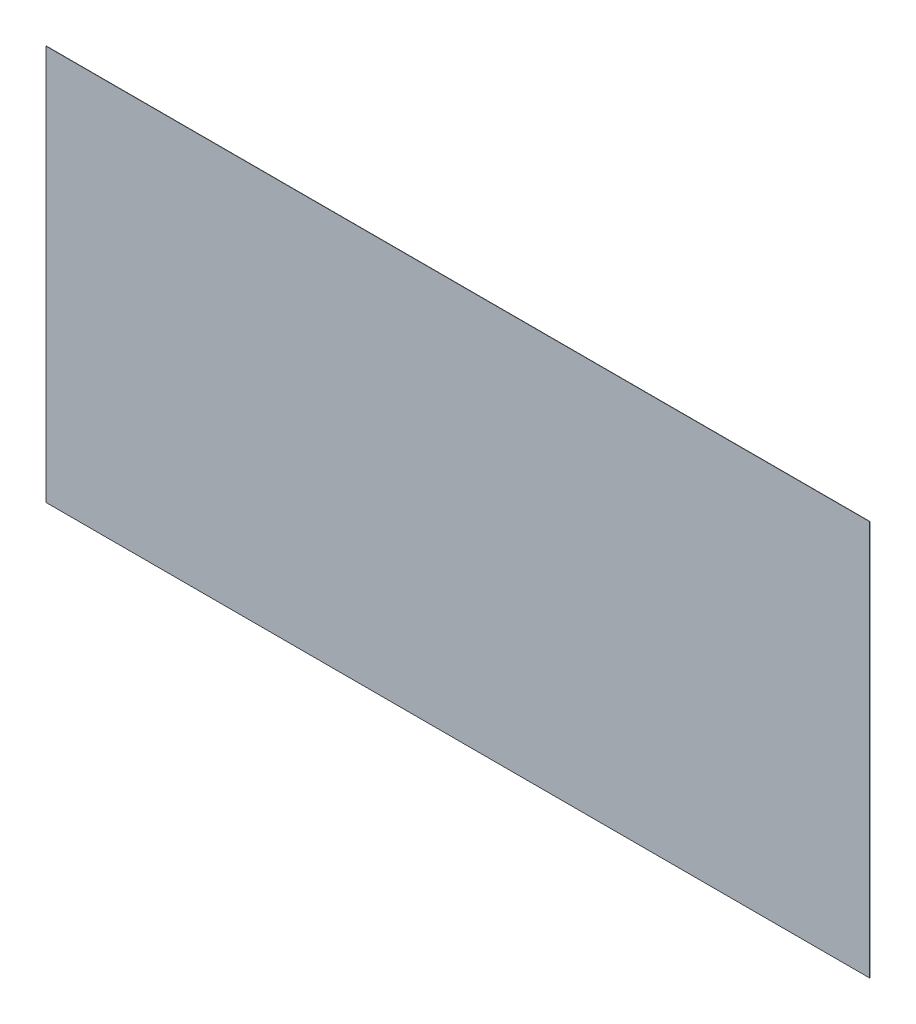
ISO-10303-21;
HEADER;
FILE_DESCRIPTION(('STEP AP214'),'2;1');
FILE_NAME('part.step','',(''),(''),'','','');
FILE_SCHEMA(('AUTOMOTIVE_DESIGN { 1 0 10303 214 1 1 1 1 }'));
ENDSEC;
DATA;
#1=APPLICATION_CONTEXT('core data for automotive mechanical design processes');
#2=APPLICATION_PROTOCOL_DEFINITION('international standard','automotive_design',2000,#1);
#3=PRODUCT_CONTEXT('',#1,'mechanical');
#4=PRODUCT('Part','Part','',(#3));
#5=PRODUCT_RELATED_PRODUCT_CATEGORY('part','',(#4));
#6=PRODUCT_DEFINITION_FORMATION('','',#4);
#7=PRODUCT_DEFINITION_CONTEXT('part definition',#1,'design');
#8=PRODUCT_DEFINITION('design','',#6,#7);
#9=PRODUCT_DEFINITION_SHAPE('','',#8);
#10=(LENGTH_UNIT() NAMED_UNIT(*) SI_UNIT(.MILLI.,.METRE.));
#11=(NAMED_UNIT(*) PLANE_ANGLE_UNIT() SI_UNIT($,.RADIAN.));
#12=(NAMED_UNIT(*) SI_UNIT($,.STERADIAN.) SOLID_ANGLE_UNIT());
#13=UNCERTAINTY_MEASURE_WITH_UNIT(LENGTH_MEASURE(1.E-05),#10,'distance_accuracy_value','');
#14=(GEOMETRIC_REPRESENTATION_CONTEXT(3) GLOBAL_UNCERTAINTY_ASSIGNED_CONTEXT((#13)) GLOBAL_UNIT_ASSIGNED_CONTEXT((#10,
#11,#12)) REPRESENTATION_CONTEXT('',''));
#15=CARTESIAN_POINT('',(0.,0.,0.));
#16=DIRECTION('',(0.,0.,1.));
#17=DIRECTION('',(1.,0.,0.));
#18=AXIS2_PLACEMENT_3D('',#15,#16,#17);
#19=CARTESIAN_POINT('',(-125.,-60.,151.4032));
#20=DIRECTION('',(1.,0.,0.));
#21=DIRECTION('',(0.,1.,0.));
#22=AXIS2_PLACEMENT_3D('',#19,#20,#21);
#23=PLANE('',#22);
#24=DIRECTION('',(0.,-1.,0.));
#25=VECTOR('',#24,1.);
#26=CARTESIAN_POINT('',(-125.,-60.,151.327));
#27=LINE('',#26,#25);
#28=CARTESIAN_POINT('',(-125.,60.,151.327));
#29=VERTEX_POINT('',#28);
#30=CARTESIAN_POINT('',(-125.,-60.,151.327));
#31=VERTEX_POINT('',#30);
#32=EDGE_CURVE('E118',#29,#31,#27,.T.);
#33=ORIENTED_EDGE('',*,*,#32,.T.);
#34=DIRECTION('',(0.,0.,-1.));
#35=VECTOR('',#34,1.);
#36=CARTESIAN_POINT('',(-125.,-60.,151.4032));
#37=LINE('',#36,#35);
#38=CARTESIAN_POINT('',(-125.,-60.,151.4032));
#39=VERTEX_POINT('',#38);
#40=EDGE_CURVE('E11',#39,#31,#37,.T.);
#41=ORIENTED_EDGE('',*,*,#40,.F.);
#42=DIRECTION('',(0.,-1.,0.));
#43=VECTOR('',#42,1.);
#44=CARTESIAN_POINT('',(-125.,-60.,151.4032));
#45=LINE('',#44,#43);
#46=CARTESIAN_POINT('',(-125.,60.,151.4032));
#47=VERTEX_POINT('',#46);
#48=EDGE_CURVE('E102',#47,#39,#45,.T.);
#49=ORIENTED_EDGE('',*,*,#48,.F.);
#50=DIRECTION('',(0.,0.,-1.));
#51=VECTOR('',#50,1.);
#52=CARTESIAN_POINT('',(-125.,60.,151.4032));
#53=LINE('',#52,#51);
#54=EDGE_CURVE('E114',#47,#29,#53,.T.);
#55=ORIENTED_EDGE('',*,*,#54,.T.);
#56=EDGE_LOOP('',(#33,#41,#49,#55));
#57=FACE_BOUND('',#56,.T.);
#58=ADVANCED_FACE('F50',(#57),#23,.F.);
#59=CARTESIAN_POINT('',(-125.,-60.,151.4032));
#60=DIRECTION('',(0.,1.,0.));
#61=DIRECTION('',(0.,0.,1.));
#62=AXIS2_PLACEMENT_3D('',#59,#60,#61);
#63=PLANE('',#62);
#64=DIRECTION('',(1.,0.,0.));
#65=VECTOR('',#64,1.);
#66=CARTESIAN_POINT('',(-125.,-60.,151.327));
#67=LINE('',#66,#65);
#68=CARTESIAN_POINT('',(125.,-60.,151.327));
#69=VERTEX_POINT('',#68);
#70=EDGE_CURVE('E107',#31,#69,#67,.T.);
#71=ORIENTED_EDGE('',*,*,#70,.T.);
#72=DIRECTION('',(0.,0.,-1.));
#73=VECTOR('',#72,1.);
#74=CARTESIAN_POINT('',(125.,-60.,151.4032));
#75=LINE('',#74,#73);
#76=CARTESIAN_POINT('',(125.,-60.,151.4032));
#77=VERTEX_POINT('',#76);
#78=EDGE_CURVE('E59',#77,#69,#75,.T.);
#79=ORIENTED_EDGE('',*,*,#78,.F.);
#80=DIRECTION('',(1.,0.,0.));
#81=VECTOR('',#80,1.);
#82=CARTESIAN_POINT('',(-125.,-60.,151.4032));
#83=LINE('',#82,#81);
#84=EDGE_CURVE('E97',#39,#77,#83,.T.);
#85=ORIENTED_EDGE('',*,*,#84,.F.);
#86=ORIENTED_EDGE('',*,*,#40,.T.);
#87=EDGE_LOOP('',(#71,#79,#85,#86));
#88=FACE_BOUND('',#87,.T.);
#89=ADVANCED_FACE('F106',(#88),#63,.F.);
#90=CARTESIAN_POINT('',(125.,-60.,151.4032));
#91=DIRECTION('',(-1.,0.,0.));
#92=DIRECTION('',(0.,-1.,0.));
#93=AXIS2_PLACEMENT_3D('',#90,#91,#92);
#94=PLANE('',#93);
#95=DIRECTION('',(0.,1.,0.));
#96=VECTOR('',#95,1.);
#97=CARTESIAN_POINT('',(125.,-60.,151.327));
#98=LINE('',#97,#96);
#99=CARTESIAN_POINT('',(125.,60.,151.327));
#100=VERTEX_POINT('',#99);
#101=EDGE_CURVE('E84',#69,#100,#98,.T.);
#102=ORIENTED_EDGE('',*,*,#101,.T.);
#103=DIRECTION('',(0.,0.,-1.));
#104=VECTOR('',#103,1.);
#105=CARTESIAN_POINT('',(125.,60.,151.4032));
#106=LINE('',#105,#104);
#107=CARTESIAN_POINT('',(125.,60.,151.4032));
#108=VERTEX_POINT('',#107);
#109=EDGE_CURVE('E109',#108,#100,#106,.T.);
#110=ORIENTED_EDGE('',*,*,#109,.F.);
#111=DIRECTION('',(0.,1.,0.));
#112=VECTOR('',#111,1.);
#113=CARTESIAN_POINT('',(125.,-60.,151.4032));
#114=LINE('',#113,#112);
#115=EDGE_CURVE('E100',#77,#108,#114,.T.);
#116=ORIENTED_EDGE('',*,*,#115,.F.);
#117=ORIENTED_EDGE('',*,*,#78,.T.);
#118=EDGE_LOOP('',(#102,#110,#116,#117));
#119=FACE_BOUND('',#118,.T.);
#120=ADVANCED_FACE('F110',(#119),#94,.F.);
#121=CARTESIAN_POINT('',(-125.,60.,151.4032));
#122=DIRECTION('',(0.,-1.,0.));
#123=DIRECTION('',(1.,0.,0.));
#124=AXIS2_PLACEMENT_3D('',#121,#122,#123);
#125=PLANE('',#124);
#126=DIRECTION('',(-1.,0.,0.));
#127=VECTOR('',#126,1.);
#128=CARTESIAN_POINT('',(-125.,60.,151.327));
#129=LINE('',#128,#127);
#130=EDGE_CURVE('E90',#100,#29,#129,.T.);
#131=ORIENTED_EDGE('',*,*,#130,.T.);
#132=ORIENTED_EDGE('',*,*,#54,.F.);
#133=DIRECTION('',(-1.,0.,0.));
#134=VECTOR('',#133,1.);
#135=CARTESIAN_POINT('',(-125.,60.,151.4032));
#136=LINE('',#135,#134);
#137=EDGE_CURVE('E67',#108,#47,#136,.T.);
#138=ORIENTED_EDGE('',*,*,#137,.F.);
#139=ORIENTED_EDGE('',*,*,#109,.T.);
#140=EDGE_LOOP('',(#131,#132,#138,#139));
#141=FACE_BOUND('',#140,.T.);
#142=ADVANCED_FACE('F131',(#141),#125,.F.);
#143=CARTESIAN_POINT('',(0.,0.,151.4032));
#144=DIRECTION('',(0.,0.,-1.));
#145=DIRECTION('',(-1.,0.,0.));
#146=AXIS2_PLACEMENT_3D('',#143,#144,#145);
#147=PLANE('',#146);
#148=ORIENTED_EDGE('',*,*,#48,.T.);
#149=ORIENTED_EDGE('',*,*,#84,.T.);
#150=ORIENTED_EDGE('',*,*,#115,.T.);
#151=ORIENTED_EDGE('',*,*,#137,.T.);
#152=EDGE_LOOP('',(#148,#149,#150,#151));
#153=FACE_BOUND('',#152,.T.);
#154=ADVANCED_FACE('F98',(#153),#147,.F.);
#155=CARTESIAN_POINT('',(0.,0.,151.327));
#156=DIRECTION('',(0.,0.,-1.));
#157=DIRECTION('',(-1.,0.,0.));
#158=AXIS2_PLACEMENT_3D('',#155,#156,#157);
#159=PLANE('',#158);
#160=ORIENTED_EDGE('',*,*,#32,.F.);
#161=ORIENTED_EDGE('',*,*,#130,.F.);
#162=ORIENTED_EDGE('',*,*,#101,.F.);
#163=ORIENTED_EDGE('',*,*,#70,.F.);
#164=EDGE_LOOP('',(#160,#161,#162,#163));
#165=FACE_BOUND('',#164,.T.);
#166=ADVANCED_FACE('F134',(#165),#159,.T.);
#167=CLOSED_SHELL('',(#58,#89,#120,#142,#154,#166));
#168=MANIFOLD_SOLID_BREP('B2',#167);
#169=ADVANCED_BREP_SHAPE_REPRESENTATION('',(#18,#168),#14);
#170=SHAPE_DEFINITION_REPRESENTATION(#9,#169);
ENDSEC;
END-ISO-10303-21;
